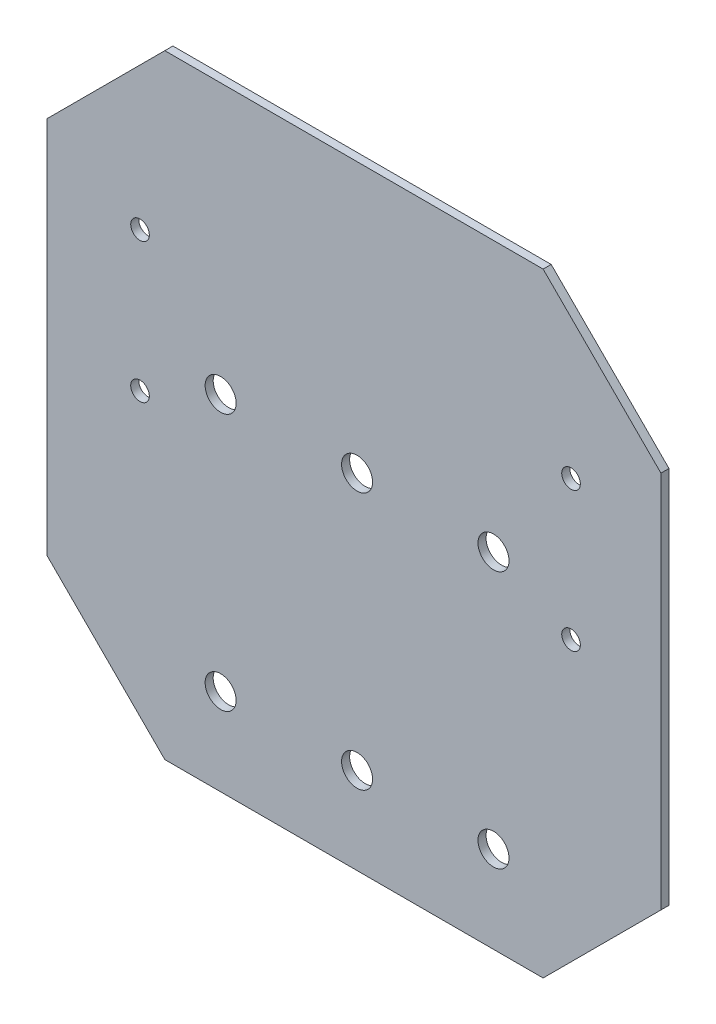
ISO-10303-21;
HEADER;
FILE_DESCRIPTION(('STEP AP214'),'2;1');
FILE_NAME('part.step','',(''),(''),'','','');
FILE_SCHEMA(('AUTOMOTIVE_DESIGN { 1 0 10303 214 1 1 1 1 }'));
ENDSEC;
DATA;
#1=APPLICATION_CONTEXT('core data for automotive mechanical design processes');
#2=APPLICATION_PROTOCOL_DEFINITION('international standard','automotive_design',2000,#1);
#3=PRODUCT_CONTEXT('',#1,'mechanical');
#4=PRODUCT('Part','Part','',(#3));
#5=PRODUCT_RELATED_PRODUCT_CATEGORY('part','',(#4));
#6=PRODUCT_DEFINITION_FORMATION('','',#4);
#7=PRODUCT_DEFINITION_CONTEXT('part definition',#1,'design');
#8=PRODUCT_DEFINITION('design','',#6,#7);
#9=PRODUCT_DEFINITION_SHAPE('','',#8);
#10=(LENGTH_UNIT() NAMED_UNIT(*) SI_UNIT(.MILLI.,.METRE.));
#11=(NAMED_UNIT(*) PLANE_ANGLE_UNIT() SI_UNIT($,.RADIAN.));
#12=(NAMED_UNIT(*) SI_UNIT($,.STERADIAN.) SOLID_ANGLE_UNIT());
#13=UNCERTAINTY_MEASURE_WITH_UNIT(LENGTH_MEASURE(1.E-05),#10,'distance_accuracy_value','');
#14=(GEOMETRIC_REPRESENTATION_CONTEXT(3) GLOBAL_UNCERTAINTY_ASSIGNED_CONTEXT((#13)) GLOBAL_UNIT_ASSIGNED_CONTEXT((#10,
#11,#12)) REPRESENTATION_CONTEXT('',''));
#15=CARTESIAN_POINT('',(0.,0.,0.));
#16=DIRECTION('',(0.,0.,1.));
#17=DIRECTION('',(1.,0.,0.));
#18=AXIS2_PLACEMENT_3D('',#15,#16,#17);
#19=CARTESIAN_POINT('',(0.,0.,1.3));
#20=DIRECTION('',(0.,0.,-1.));
#21=DIRECTION('',(-1.,0.,0.));
#22=AXIS2_PLACEMENT_3D('',#19,#20,#21);
#23=PLANE('',#22);
#24=CARTESIAN_POINT('',(50.3246763242411,35.186140305157,1.3));
#25=DIRECTION('',(0.,0.,1.));
#26=DIRECTION('',(1.,0.,0.));
#27=AXIS2_PLACEMENT_3D('',#24,#25,#26);
#28=CIRCLE('',#27,1.5);
#29=CARTESIAN_POINT('',(51.8246763242411,35.186140305157,1.3));
#30=VERTEX_POINT('',#29);
#31=EDGE_CURVE('E223',#30,#30,#28,.T.);
#32=ORIENTED_EDGE('',*,*,#31,.F.);
#33=EDGE_LOOP('',(#32));
#34=FACE_BOUND('',#33,.T.);
#35=CARTESIAN_POINT('',(-19.1753236757587,12.686140305157,1.3));
#36=DIRECTION('',(0.,0.,1.));
#37=DIRECTION('',(1.,0.,0.));
#38=AXIS2_PLACEMENT_3D('',#35,#36,#37);
#39=CIRCLE('',#38,1.5);
#40=CARTESIAN_POINT('',(-17.6753236757587,12.686140305157,1.3));
#41=VERTEX_POINT('',#40);
#42=EDGE_CURVE('E211',#41,#41,#39,.T.);
#43=ORIENTED_EDGE('',*,*,#42,.F.);
#44=EDGE_LOOP('',(#43));
#45=FACE_BOUND('',#44,.T.);
#46=CARTESIAN_POINT('',(37.8246763242411,-22.8138596948429,1.3));
#47=DIRECTION('',(0.,0.,1.));
#48=DIRECTION('',(1.,0.,0.));
#49=AXIS2_PLACEMENT_3D('',#46,#47,#48);
#50=CIRCLE('',#49,2.5);
#51=CARTESIAN_POINT('',(40.3246763242411,-22.8138596948429,1.3));
#52=VERTEX_POINT('',#51);
#53=EDGE_CURVE('E199',#52,#52,#50,.T.);
#54=ORIENTED_EDGE('',*,*,#53,.F.);
#55=EDGE_LOOP('',(#54));
#56=FACE_BOUND('',#55,.T.);
#57=CARTESIAN_POINT('',(37.8246763242411,18.6861403051571,1.3));
#58=DIRECTION('',(0.,0.,1.));
#59=DIRECTION('',(1.,0.,0.));
#60=AXIS2_PLACEMENT_3D('',#57,#58,#59);
#61=CIRCLE('',#60,2.5);
#62=CARTESIAN_POINT('',(40.3246763242411,18.6861403051571,1.3));
#63=VERTEX_POINT('',#62);
#64=EDGE_CURVE('E187',#63,#63,#61,.T.);
#65=ORIENTED_EDGE('',*,*,#64,.F.);
#66=EDGE_LOOP('',(#65));
#67=FACE_BOUND('',#66,.T.);
#68=CARTESIAN_POINT('',(-6.17532367575889,18.6861403051571,1.3));
#69=DIRECTION('',(0.,0.,1.));
#70=DIRECTION('',(1.,0.,0.));
#71=AXIS2_PLACEMENT_3D('',#68,#69,#70);
#72=CIRCLE('',#71,2.5);
#73=CARTESIAN_POINT('',(-3.67532367575889,18.6861403051571,1.3));
#74=VERTEX_POINT('',#73);
#75=EDGE_CURVE('E133',#74,#74,#72,.T.);
#76=ORIENTED_EDGE('',*,*,#75,.F.);
#77=EDGE_LOOP('',(#76));
#78=FACE_BOUND('',#77,.T.);
#79=DIRECTION('',(-0.707106781186547,-0.707106781186548,0.));
#80=VECTOR('',#79,1.);
#81=CARTESIAN_POINT('',(-15.1753236757587,62.186140305157,1.3));
#82=LINE('',#81,#80);
#83=CARTESIAN_POINT('',(-15.1753236757587,62.186140305157,1.3));
#84=VERTEX_POINT('',#83);
#85=CARTESIAN_POINT('',(-34.1753236757587,43.186140305157,1.3));
#86=VERTEX_POINT('',#85);
#87=EDGE_CURVE('E144',#84,#86,#82,.T.);
#88=ORIENTED_EDGE('',*,*,#87,.T.);
#89=DIRECTION('',(0.,-1.,0.));
#90=VECTOR('',#89,1.);
#91=CARTESIAN_POINT('',(-34.1753236757587,43.186140305157,1.3));
#92=LINE('',#91,#90);
#93=CARTESIAN_POINT('',(-34.1753236757587,-17.813859694843,1.3));
#94=VERTEX_POINT('',#93);
#95=EDGE_CURVE('E92',#86,#94,#92,.T.);
#96=ORIENTED_EDGE('',*,*,#95,.T.);
#97=DIRECTION('',(0.707106781186549,-0.707106781186546,0.));
#98=VECTOR('',#97,1.);
#99=CARTESIAN_POINT('',(-15.1753236757588,-36.8138596948428,1.3));
#100=LINE('',#99,#98);
#101=CARTESIAN_POINT('',(-15.1753236757588,-36.8138596948428,1.3));
#102=VERTEX_POINT('',#101);
#103=EDGE_CURVE('E159',#94,#102,#100,.T.);
#104=ORIENTED_EDGE('',*,*,#103,.T.);
#105=DIRECTION('',(1.,0.,0.));
#106=VECTOR('',#105,1.);
#107=CARTESIAN_POINT('',(45.8246763242411,-36.8138596948428,1.3));
#108=LINE('',#107,#106);
#109=CARTESIAN_POINT('',(45.8246763242411,-36.8138596948428,1.3));
#110=VERTEX_POINT('',#109);
#111=EDGE_CURVE('E172',#102,#110,#108,.T.);
#112=ORIENTED_EDGE('',*,*,#111,.T.);
#113=DIRECTION('',(0.707106781186546,0.707106781186549,0.));
#114=VECTOR('',#113,1.);
#115=CARTESIAN_POINT('',(64.8246763242411,-17.8138596948428,1.3));
#116=LINE('',#115,#114);
#117=CARTESIAN_POINT('',(64.8246763242411,-17.8138596948428,1.3));
#118=VERTEX_POINT('',#117);
#119=EDGE_CURVE('E111',#110,#118,#116,.T.);
#120=ORIENTED_EDGE('',*,*,#119,.T.);
#121=DIRECTION('',(0.,1.,0.));
#122=VECTOR('',#121,1.);
#123=CARTESIAN_POINT('',(64.8246763242413,43.1861403051571,1.3));
#124=LINE('',#123,#122);
#125=CARTESIAN_POINT('',(64.8246763242413,43.1861403051571,1.3));
#126=VERTEX_POINT('',#125);
#127=EDGE_CURVE('E105',#118,#126,#124,.T.);
#128=ORIENTED_EDGE('',*,*,#127,.T.);
#129=DIRECTION('',(-0.707106781186548,0.707106781186547,0.));
#130=VECTOR('',#129,1.);
#131=CARTESIAN_POINT('',(45.8246763242413,62.186140305157,1.3));
#132=LINE('',#131,#130);
#133=CARTESIAN_POINT('',(45.8246763242413,62.186140305157,1.3));
#134=VERTEX_POINT('',#133);
#135=EDGE_CURVE('E109',#126,#134,#132,.T.);
#136=ORIENTED_EDGE('',*,*,#135,.T.);
#137=DIRECTION('',(-1.,0.,0.));
#138=VECTOR('',#137,1.);
#139=CARTESIAN_POINT('',(-15.1753236757587,62.186140305157,1.3));
#140=LINE('',#139,#138);
#141=EDGE_CURVE('E49',#134,#84,#140,.T.);
#142=ORIENTED_EDGE('',*,*,#141,.T.);
#143=EDGE_LOOP('',(#88,#96,#104,#112,#120,#128,#136,#142));
#144=FACE_BOUND('',#143,.T.);
#145=CARTESIAN_POINT('',(15.8246763242411,18.6861403051571,1.3));
#146=DIRECTION('',(0.,0.,1.));
#147=DIRECTION('',(1.,0.,0.));
#148=AXIS2_PLACEMENT_3D('',#145,#146,#147);
#149=CIRCLE('',#148,2.5);
#150=CARTESIAN_POINT('',(18.3246763242411,18.6861403051571,1.3));
#151=VERTEX_POINT('',#150);
#152=EDGE_CURVE('E181',#151,#151,#149,.T.);
#153=ORIENTED_EDGE('',*,*,#152,.F.);
#154=EDGE_LOOP('',(#153));
#155=FACE_BOUND('',#154,.T.);
#156=CARTESIAN_POINT('',(15.8246763242411,-22.8138596948429,1.3));
#157=DIRECTION('',(0.,0.,1.));
#158=DIRECTION('',(1.,0.,0.));
#159=AXIS2_PLACEMENT_3D('',#156,#157,#158);
#160=CIRCLE('',#159,2.5);
#161=CARTESIAN_POINT('',(18.3246763242411,-22.8138596948429,1.3));
#162=VERTEX_POINT('',#161);
#163=EDGE_CURVE('E193',#162,#162,#160,.T.);
#164=ORIENTED_EDGE('',*,*,#163,.F.);
#165=EDGE_LOOP('',(#164));
#166=FACE_BOUND('',#165,.T.);
#167=CARTESIAN_POINT('',(-6.17532367575889,-22.8138596948429,1.3));
#168=DIRECTION('',(0.,0.,1.));
#169=DIRECTION('',(1.,0.,0.));
#170=AXIS2_PLACEMENT_3D('',#167,#168,#169);
#171=CIRCLE('',#170,2.5);
#172=CARTESIAN_POINT('',(-3.67532367575889,-22.8138596948429,1.3));
#173=VERTEX_POINT('',#172);
#174=EDGE_CURVE('E205',#173,#173,#171,.T.);
#175=ORIENTED_EDGE('',*,*,#174,.F.);
#176=EDGE_LOOP('',(#175));
#177=FACE_BOUND('',#176,.T.);
#178=CARTESIAN_POINT('',(-19.1753236757587,35.186140305157,1.3));
#179=DIRECTION('',(0.,0.,1.));
#180=DIRECTION('',(1.,0.,0.));
#181=AXIS2_PLACEMENT_3D('',#178,#179,#180);
#182=CIRCLE('',#181,1.5);
#183=CARTESIAN_POINT('',(-17.6753236757587,35.186140305157,1.3));
#184=VERTEX_POINT('',#183);
#185=EDGE_CURVE('E217',#184,#184,#182,.T.);
#186=ORIENTED_EDGE('',*,*,#185,.F.);
#187=EDGE_LOOP('',(#186));
#188=FACE_BOUND('',#187,.T.);
#189=CARTESIAN_POINT('',(50.3246763242411,12.686140305157,1.3));
#190=DIRECTION('',(0.,0.,1.));
#191=DIRECTION('',(1.,0.,0.));
#192=AXIS2_PLACEMENT_3D('',#189,#190,#191);
#193=CIRCLE('',#192,1.5);
#194=CARTESIAN_POINT('',(51.8246763242411,12.686140305157,1.3));
#195=VERTEX_POINT('',#194);
#196=EDGE_CURVE('E229',#195,#195,#193,.T.);
#197=ORIENTED_EDGE('',*,*,#196,.F.);
#198=EDGE_LOOP('',(#197));
#199=FACE_BOUND('',#198,.T.);
#200=ADVANCED_FACE('F32',(#34,#45,#56,#67,#78,#144,#155,#166,#177,#188,#199),#23,.F.);
#201=CARTESIAN_POINT('',(0.,0.,0.));
#202=DIRECTION('',(0.,0.,-1.));
#203=DIRECTION('',(-1.,0.,0.));
#204=AXIS2_PLACEMENT_3D('',#201,#202,#203);
#205=PLANE('',#204);
#206=CARTESIAN_POINT('',(50.3246763242411,35.186140305157,0.));
#207=DIRECTION('',(0.,0.,1.));
#208=DIRECTION('',(1.,0.,0.));
#209=AXIS2_PLACEMENT_3D('',#206,#207,#208);
#210=CIRCLE('',#209,1.5);
#211=CARTESIAN_POINT('',(51.8246763242411,35.186140305157,0.));
#212=VERTEX_POINT('',#211);
#213=EDGE_CURVE('E226',#212,#212,#210,.T.);
#214=ORIENTED_EDGE('',*,*,#213,.T.);
#215=EDGE_LOOP('',(#214));
#216=FACE_BOUND('',#215,.T.);
#217=CARTESIAN_POINT('',(-19.1753236757587,12.686140305157,0.));
#218=DIRECTION('',(0.,0.,1.));
#219=DIRECTION('',(1.,0.,0.));
#220=AXIS2_PLACEMENT_3D('',#217,#218,#219);
#221=CIRCLE('',#220,1.5);
#222=CARTESIAN_POINT('',(-17.6753236757587,12.686140305157,0.));
#223=VERTEX_POINT('',#222);
#224=EDGE_CURVE('E214',#223,#223,#221,.T.);
#225=ORIENTED_EDGE('',*,*,#224,.T.);
#226=EDGE_LOOP('',(#225));
#227=FACE_BOUND('',#226,.T.);
#228=CARTESIAN_POINT('',(37.8246763242411,-22.8138596948429,0.));
#229=DIRECTION('',(0.,0.,1.));
#230=DIRECTION('',(1.,0.,0.));
#231=AXIS2_PLACEMENT_3D('',#228,#229,#230);
#232=CIRCLE('',#231,2.5);
#233=CARTESIAN_POINT('',(40.3246763242411,-22.8138596948429,0.));
#234=VERTEX_POINT('',#233);
#235=EDGE_CURVE('E202',#234,#234,#232,.T.);
#236=ORIENTED_EDGE('',*,*,#235,.T.);
#237=EDGE_LOOP('',(#236));
#238=FACE_BOUND('',#237,.T.);
#239=CARTESIAN_POINT('',(37.8246763242411,18.6861403051571,0.));
#240=DIRECTION('',(0.,0.,1.));
#241=DIRECTION('',(1.,0.,0.));
#242=AXIS2_PLACEMENT_3D('',#239,#240,#241);
#243=CIRCLE('',#242,2.5);
#244=CARTESIAN_POINT('',(40.3246763242411,18.6861403051571,0.));
#245=VERTEX_POINT('',#244);
#246=EDGE_CURVE('E190',#245,#245,#243,.T.);
#247=ORIENTED_EDGE('',*,*,#246,.T.);
#248=EDGE_LOOP('',(#247));
#249=FACE_BOUND('',#248,.T.);
#250=CARTESIAN_POINT('',(-6.17532367575889,18.6861403051571,0.));
#251=DIRECTION('',(0.,0.,1.));
#252=DIRECTION('',(1.,0.,0.));
#253=AXIS2_PLACEMENT_3D('',#250,#251,#252);
#254=CIRCLE('',#253,2.5);
#255=CARTESIAN_POINT('',(-3.67532367575889,18.6861403051571,0.));
#256=VERTEX_POINT('',#255);
#257=EDGE_CURVE('E178',#256,#256,#254,.T.);
#258=ORIENTED_EDGE('',*,*,#257,.T.);
#259=EDGE_LOOP('',(#258));
#260=FACE_BOUND('',#259,.T.);
#261=DIRECTION('',(-0.707106781186547,-0.707106781186548,0.));
#262=VECTOR('',#261,1.);
#263=CARTESIAN_POINT('',(-15.1753236757587,62.186140305157,0.));
#264=LINE('',#263,#262);
#265=CARTESIAN_POINT('',(-15.1753236757587,62.186140305157,0.));
#266=VERTEX_POINT('',#265);
#267=CARTESIAN_POINT('',(-34.1753236757587,43.186140305157,0.));
#268=VERTEX_POINT('',#267);
#269=EDGE_CURVE('E129',#266,#268,#264,.T.);
#270=ORIENTED_EDGE('',*,*,#269,.F.);
#271=DIRECTION('',(-1.,0.,0.));
#272=VECTOR('',#271,1.);
#273=CARTESIAN_POINT('',(-15.1753236757587,62.186140305157,0.));
#274=LINE('',#273,#272);
#275=CARTESIAN_POINT('',(45.8246763242413,62.186140305157,0.));
#276=VERTEX_POINT('',#275);
#277=EDGE_CURVE('E84',#276,#266,#274,.T.);
#278=ORIENTED_EDGE('',*,*,#277,.F.);
#279=DIRECTION('',(-0.707106781186548,0.707106781186547,0.));
#280=VECTOR('',#279,1.);
#281=CARTESIAN_POINT('',(45.8246763242413,62.186140305157,0.));
#282=LINE('',#281,#280);
#283=CARTESIAN_POINT('',(64.8246763242413,43.1861403051571,0.));
#284=VERTEX_POINT('',#283);
#285=EDGE_CURVE('E78',#284,#276,#282,.T.);
#286=ORIENTED_EDGE('',*,*,#285,.F.);
#287=DIRECTION('',(0.,1.,0.));
#288=VECTOR('',#287,1.);
#289=CARTESIAN_POINT('',(64.8246763242413,43.1861403051571,0.));
#290=LINE('',#289,#288);
#291=CARTESIAN_POINT('',(64.8246763242411,-17.8138596948428,0.));
#292=VERTEX_POINT('',#291);
#293=EDGE_CURVE('E119',#292,#284,#290,.T.);
#294=ORIENTED_EDGE('',*,*,#293,.F.);
#295=DIRECTION('',(0.707106781186546,0.707106781186549,0.));
#296=VECTOR('',#295,1.);
#297=CARTESIAN_POINT('',(64.8246763242411,-17.8138596948428,0.));
#298=LINE('',#297,#296);
#299=CARTESIAN_POINT('',(45.8246763242411,-36.8138596948428,0.));
#300=VERTEX_POINT('',#299);
#301=EDGE_CURVE('E139',#300,#292,#298,.T.);
#302=ORIENTED_EDGE('',*,*,#301,.F.);
#303=DIRECTION('',(1.,0.,0.));
#304=VECTOR('',#303,1.);
#305=CARTESIAN_POINT('',(45.8246763242411,-36.8138596948428,0.));
#306=LINE('',#305,#304);
#307=CARTESIAN_POINT('',(-15.1753236757588,-36.8138596948428,0.));
#308=VERTEX_POINT('',#307);
#309=EDGE_CURVE('E137',#308,#300,#306,.T.);
#310=ORIENTED_EDGE('',*,*,#309,.F.);
#311=DIRECTION('',(0.707106781186549,-0.707106781186546,0.));
#312=VECTOR('',#311,1.);
#313=CARTESIAN_POINT('',(-15.1753236757588,-36.8138596948428,0.));
#314=LINE('',#313,#312);
#315=CARTESIAN_POINT('',(-34.1753236757587,-17.813859694843,0.));
#316=VERTEX_POINT('',#315);
#317=EDGE_CURVE('E135',#316,#308,#314,.T.);
#318=ORIENTED_EDGE('',*,*,#317,.F.);
#319=DIRECTION('',(0.,-1.,0.));
#320=VECTOR('',#319,1.);
#321=CARTESIAN_POINT('',(-34.1753236757587,43.186140305157,0.));
#322=LINE('',#321,#320);
#323=EDGE_CURVE('E132',#268,#316,#322,.T.);
#324=ORIENTED_EDGE('',*,*,#323,.F.);
#325=EDGE_LOOP('',(#270,#278,#286,#294,#302,#310,#318,#324));
#326=FACE_BOUND('',#325,.T.);
#327=CARTESIAN_POINT('',(15.8246763242411,18.6861403051571,0.));
#328=DIRECTION('',(0.,0.,1.));
#329=DIRECTION('',(1.,0.,0.));
#330=AXIS2_PLACEMENT_3D('',#327,#328,#329);
#331=CIRCLE('',#330,2.5);
#332=CARTESIAN_POINT('',(18.3246763242411,18.6861403051571,0.));
#333=VERTEX_POINT('',#332);
#334=EDGE_CURVE('E184',#333,#333,#331,.T.);
#335=ORIENTED_EDGE('',*,*,#334,.T.);
#336=EDGE_LOOP('',(#335));
#337=FACE_BOUND('',#336,.T.);
#338=CARTESIAN_POINT('',(15.8246763242411,-22.8138596948429,0.));
#339=DIRECTION('',(0.,0.,1.));
#340=DIRECTION('',(1.,0.,0.));
#341=AXIS2_PLACEMENT_3D('',#338,#339,#340);
#342=CIRCLE('',#341,2.5);
#343=CARTESIAN_POINT('',(18.3246763242411,-22.8138596948429,0.));
#344=VERTEX_POINT('',#343);
#345=EDGE_CURVE('E196',#344,#344,#342,.T.);
#346=ORIENTED_EDGE('',*,*,#345,.T.);
#347=EDGE_LOOP('',(#346));
#348=FACE_BOUND('',#347,.T.);
#349=CARTESIAN_POINT('',(-6.17532367575889,-22.8138596948429,0.));
#350=DIRECTION('',(0.,0.,1.));
#351=DIRECTION('',(1.,0.,0.));
#352=AXIS2_PLACEMENT_3D('',#349,#350,#351);
#353=CIRCLE('',#352,2.5);
#354=CARTESIAN_POINT('',(-3.67532367575889,-22.8138596948429,0.));
#355=VERTEX_POINT('',#354);
#356=EDGE_CURVE('E208',#355,#355,#353,.T.);
#357=ORIENTED_EDGE('',*,*,#356,.T.);
#358=EDGE_LOOP('',(#357));
#359=FACE_BOUND('',#358,.T.);
#360=CARTESIAN_POINT('',(-19.1753236757587,35.186140305157,0.));
#361=DIRECTION('',(0.,0.,1.));
#362=DIRECTION('',(1.,0.,0.));
#363=AXIS2_PLACEMENT_3D('',#360,#361,#362);
#364=CIRCLE('',#363,1.5);
#365=CARTESIAN_POINT('',(-17.6753236757587,35.186140305157,0.));
#366=VERTEX_POINT('',#365);
#367=EDGE_CURVE('E220',#366,#366,#364,.T.);
#368=ORIENTED_EDGE('',*,*,#367,.T.);
#369=EDGE_LOOP('',(#368));
#370=FACE_BOUND('',#369,.T.);
#371=CARTESIAN_POINT('',(50.3246763242411,12.686140305157,0.));
#372=DIRECTION('',(0.,0.,1.));
#373=DIRECTION('',(1.,0.,0.));
#374=AXIS2_PLACEMENT_3D('',#371,#372,#373);
#375=CIRCLE('',#374,1.5);
#376=CARTESIAN_POINT('',(51.8246763242411,12.686140305157,0.));
#377=VERTEX_POINT('',#376);
#378=EDGE_CURVE('E232',#377,#377,#375,.T.);
#379=ORIENTED_EDGE('',*,*,#378,.T.);
#380=EDGE_LOOP('',(#379));
#381=FACE_BOUND('',#380,.T.);
#382=ADVANCED_FACE('F163',(#216,#227,#238,#249,#260,#326,#337,#348,#359,#370,#381),#205,.T.);
#383=CARTESIAN_POINT('',(-15.1753236757587,62.186140305157,1.3));
#384=DIRECTION('',(0.707106781186548,-0.707106781186547,0.));
#385=DIRECTION('',(0.707106781186547,0.707106781186548,0.));
#386=AXIS2_PLACEMENT_3D('',#383,#384,#385);
#387=PLANE('',#386);
#388=ORIENTED_EDGE('',*,*,#269,.T.);
#389=DIRECTION('',(0.,0.,-1.));
#390=VECTOR('',#389,1.);
#391=CARTESIAN_POINT('',(-34.1753236757587,43.186140305157,1.3));
#392=LINE('',#391,#390);
#393=EDGE_CURVE('E11',#86,#268,#392,.T.);
#394=ORIENTED_EDGE('',*,*,#393,.F.);
#395=ORIENTED_EDGE('',*,*,#87,.F.);
#396=DIRECTION('',(0.,0.,-1.));
#397=VECTOR('',#396,1.);
#398=CARTESIAN_POINT('',(-15.1753236757587,62.186140305157,1.3));
#399=LINE('',#398,#397);
#400=EDGE_CURVE('E125',#84,#266,#399,.T.);
#401=ORIENTED_EDGE('',*,*,#400,.T.);
#402=EDGE_LOOP('',(#388,#394,#395,#401));
#403=FACE_BOUND('',#402,.T.);
#404=ADVANCED_FACE('F34',(#403),#387,.F.);
#405=CARTESIAN_POINT('',(-34.1753236757587,43.186140305157,1.3));
#406=DIRECTION('',(1.,0.,0.));
#407=DIRECTION('',(0.,1.,0.));
#408=AXIS2_PLACEMENT_3D('',#405,#406,#407);
#409=PLANE('',#408);
#410=ORIENTED_EDGE('',*,*,#323,.T.);
#411=DIRECTION('',(0.,0.,-1.));
#412=VECTOR('',#411,1.);
#413=CARTESIAN_POINT('',(-34.1753236757587,-17.813859694843,1.3));
#414=LINE('',#413,#412);
#415=EDGE_CURVE('E41',#94,#316,#414,.T.);
#416=ORIENTED_EDGE('',*,*,#415,.F.);
#417=ORIENTED_EDGE('',*,*,#95,.F.);
#418=ORIENTED_EDGE('',*,*,#393,.T.);
#419=EDGE_LOOP('',(#410,#416,#417,#418));
#420=FACE_BOUND('',#419,.T.);
#421=ADVANCED_FACE('F267',(#420),#409,.F.);
#422=CARTESIAN_POINT('',(-15.1753236757588,-36.8138596948428,1.3));
#423=DIRECTION('',(0.707106781186546,0.707106781186549,0.));
#424=DIRECTION('',(-0.707106781186549,0.707106781186546,0.));
#425=AXIS2_PLACEMENT_3D('',#422,#423,#424);
#426=PLANE('',#425);
#427=ORIENTED_EDGE('',*,*,#317,.T.);
#428=DIRECTION('',(0.,0.,-1.));
#429=VECTOR('',#428,1.);
#430=CARTESIAN_POINT('',(-15.1753236757588,-36.8138596948428,1.3));
#431=LINE('',#430,#429);
#432=EDGE_CURVE('E151',#102,#308,#431,.T.);
#433=ORIENTED_EDGE('',*,*,#432,.F.);
#434=ORIENTED_EDGE('',*,*,#103,.F.);
#435=ORIENTED_EDGE('',*,*,#415,.T.);
#436=EDGE_LOOP('',(#427,#433,#434,#435));
#437=FACE_BOUND('',#436,.T.);
#438=ADVANCED_FACE('F157',(#437),#426,.F.);
#439=CARTESIAN_POINT('',(45.8246763242411,-36.8138596948428,1.3));
#440=DIRECTION('',(0.,1.,0.));
#441=DIRECTION('',(-1.,0.,0.));
#442=AXIS2_PLACEMENT_3D('',#439,#440,#441);
#443=PLANE('',#442);
#444=ORIENTED_EDGE('',*,*,#309,.T.);
#445=DIRECTION('',(0.,0.,-1.));
#446=VECTOR('',#445,1.);
#447=CARTESIAN_POINT('',(45.8246763242411,-36.8138596948428,1.3));
#448=LINE('',#447,#446);
#449=EDGE_CURVE('E148',#110,#300,#448,.T.);
#450=ORIENTED_EDGE('',*,*,#449,.F.);
#451=ORIENTED_EDGE('',*,*,#111,.F.);
#452=ORIENTED_EDGE('',*,*,#432,.T.);
#453=EDGE_LOOP('',(#444,#450,#451,#452));
#454=FACE_BOUND('',#453,.T.);
#455=ADVANCED_FACE('F168',(#454),#443,.F.);
#456=CARTESIAN_POINT('',(64.8246763242411,-17.8138596948428,1.3));
#457=DIRECTION('',(-0.707106781186549,0.707106781186546,0.));
#458=DIRECTION('',(-0.707106781186546,-0.707106781186549,0.));
#459=AXIS2_PLACEMENT_3D('',#456,#457,#458);
#460=PLANE('',#459);
#461=ORIENTED_EDGE('',*,*,#301,.T.);
#462=DIRECTION('',(0.,0.,-1.));
#463=VECTOR('',#462,1.);
#464=CARTESIAN_POINT('',(64.8246763242411,-17.8138596948428,1.3));
#465=LINE('',#464,#463);
#466=EDGE_CURVE('E120',#118,#292,#465,.T.);
#467=ORIENTED_EDGE('',*,*,#466,.F.);
#468=ORIENTED_EDGE('',*,*,#119,.F.);
#469=ORIENTED_EDGE('',*,*,#449,.T.);
#470=EDGE_LOOP('',(#461,#467,#468,#469));
#471=FACE_BOUND('',#470,.T.);
#472=ADVANCED_FACE('F171',(#471),#460,.F.);
#473=CARTESIAN_POINT('',(64.8246763242413,43.1861403051571,1.3));
#474=DIRECTION('',(-1.,0.,0.));
#475=DIRECTION('',(0.,-1.,0.));
#476=AXIS2_PLACEMENT_3D('',#473,#474,#475);
#477=PLANE('',#476);
#478=ORIENTED_EDGE('',*,*,#293,.T.);
#479=DIRECTION('',(0.,0.,-1.));
#480=VECTOR('',#479,1.);
#481=CARTESIAN_POINT('',(64.8246763242413,43.1861403051571,1.3));
#482=LINE('',#481,#480);
#483=EDGE_CURVE('E116',#126,#284,#482,.T.);
#484=ORIENTED_EDGE('',*,*,#483,.F.);
#485=ORIENTED_EDGE('',*,*,#127,.F.);
#486=ORIENTED_EDGE('',*,*,#466,.T.);
#487=EDGE_LOOP('',(#478,#484,#485,#486));
#488=FACE_BOUND('',#487,.T.);
#489=ADVANCED_FACE('F117',(#488),#477,.F.);
#490=CARTESIAN_POINT('',(45.8246763242413,62.186140305157,1.3));
#491=DIRECTION('',(-0.707106781186547,-0.707106781186548,0.));
#492=DIRECTION('',(0.707106781186548,-0.707106781186547,0.));
#493=AXIS2_PLACEMENT_3D('',#490,#491,#492);
#494=PLANE('',#493);
#495=ORIENTED_EDGE('',*,*,#285,.T.);
#496=DIRECTION('',(0.,0.,-1.));
#497=VECTOR('',#496,1.);
#498=CARTESIAN_POINT('',(45.8246763242413,62.186140305157,1.3));
#499=LINE('',#498,#497);
#500=EDGE_CURVE('E121',#134,#276,#499,.T.);
#501=ORIENTED_EDGE('',*,*,#500,.F.);
#502=ORIENTED_EDGE('',*,*,#135,.F.);
#503=ORIENTED_EDGE('',*,*,#483,.T.);
#504=EDGE_LOOP('',(#495,#501,#502,#503));
#505=FACE_BOUND('',#504,.T.);
#506=ADVANCED_FACE('F123',(#505),#494,.F.);
#507=CARTESIAN_POINT('',(-15.1753236757587,62.186140305157,1.3));
#508=DIRECTION('',(0.,-1.,0.));
#509=DIRECTION('',(1.,0.,0.));
#510=AXIS2_PLACEMENT_3D('',#507,#508,#509);
#511=PLANE('',#510);
#512=ORIENTED_EDGE('',*,*,#277,.T.);
#513=ORIENTED_EDGE('',*,*,#400,.F.);
#514=ORIENTED_EDGE('',*,*,#141,.F.);
#515=ORIENTED_EDGE('',*,*,#500,.T.);
#516=EDGE_LOOP('',(#512,#513,#514,#515));
#517=FACE_BOUND('',#516,.T.);
#518=ADVANCED_FACE('F255',(#517),#511,.F.);
#519=CARTESIAN_POINT('',(-6.17532367575889,18.6861403051571,1.3));
#520=DIRECTION('',(0.,0.,-1.));
#521=DIRECTION('',(-1.,0.,0.));
#522=AXIS2_PLACEMENT_3D('',#519,#520,#521);
#523=CYLINDRICAL_SURFACE('',#522,2.5);
#524=ORIENTED_EDGE('',*,*,#75,.T.);
#525=EDGE_LOOP('',(#524));
#526=FACE_BOUND('',#525,.T.);
#527=ORIENTED_EDGE('',*,*,#257,.F.);
#528=EDGE_LOOP('',(#527));
#529=FACE_BOUND('',#528,.T.);
#530=ADVANCED_FACE('F252',(#526,#529),#523,.F.);
#531=CARTESIAN_POINT('',(15.8246763242411,18.6861403051571,1.3));
#532=DIRECTION('',(0.,0.,-1.));
#533=DIRECTION('',(-1.,0.,0.));
#534=AXIS2_PLACEMENT_3D('',#531,#532,#533);
#535=CYLINDRICAL_SURFACE('',#534,2.5);
#536=ORIENTED_EDGE('',*,*,#152,.T.);
#537=EDGE_LOOP('',(#536));
#538=FACE_BOUND('',#537,.T.);
#539=ORIENTED_EDGE('',*,*,#334,.F.);
#540=EDGE_LOOP('',(#539));
#541=FACE_BOUND('',#540,.T.);
#542=ADVANCED_FACE('F331',(#538,#541),#535,.F.);
#543=CARTESIAN_POINT('',(37.8246763242411,18.6861403051571,1.3));
#544=DIRECTION('',(0.,0.,-1.));
#545=DIRECTION('',(-1.,0.,0.));
#546=AXIS2_PLACEMENT_3D('',#543,#544,#545);
#547=CYLINDRICAL_SURFACE('',#546,2.5);
#548=ORIENTED_EDGE('',*,*,#64,.T.);
#549=EDGE_LOOP('',(#548));
#550=FACE_BOUND('',#549,.T.);
#551=ORIENTED_EDGE('',*,*,#246,.F.);
#552=EDGE_LOOP('',(#551));
#553=FACE_BOUND('',#552,.T.);
#554=ADVANCED_FACE('F339',(#550,#553),#547,.F.);
#555=CARTESIAN_POINT('',(15.8246763242411,-22.8138596948429,1.3));
#556=DIRECTION('',(0.,0.,-1.));
#557=DIRECTION('',(-1.,0.,0.));
#558=AXIS2_PLACEMENT_3D('',#555,#556,#557);
#559=CYLINDRICAL_SURFACE('',#558,2.5);
#560=ORIENTED_EDGE('',*,*,#163,.T.);
#561=EDGE_LOOP('',(#560));
#562=FACE_BOUND('',#561,.T.);
#563=ORIENTED_EDGE('',*,*,#345,.F.);
#564=EDGE_LOOP('',(#563));
#565=FACE_BOUND('',#564,.T.);
#566=ADVANCED_FACE('F347',(#562,#565),#559,.F.);
#567=CARTESIAN_POINT('',(37.8246763242411,-22.8138596948429,1.3));
#568=DIRECTION('',(0.,0.,-1.));
#569=DIRECTION('',(-1.,0.,0.));
#570=AXIS2_PLACEMENT_3D('',#567,#568,#569);
#571=CYLINDRICAL_SURFACE('',#570,2.5);
#572=ORIENTED_EDGE('',*,*,#53,.T.);
#573=EDGE_LOOP('',(#572));
#574=FACE_BOUND('',#573,.T.);
#575=ORIENTED_EDGE('',*,*,#235,.F.);
#576=EDGE_LOOP('',(#575));
#577=FACE_BOUND('',#576,.T.);
#578=ADVANCED_FACE('F356',(#574,#577),#571,.F.);
#579=CARTESIAN_POINT('',(-6.17532367575889,-22.8138596948429,1.3));
#580=DIRECTION('',(0.,0.,-1.));
#581=DIRECTION('',(-1.,0.,0.));
#582=AXIS2_PLACEMENT_3D('',#579,#580,#581);
#583=CYLINDRICAL_SURFACE('',#582,2.5);
#584=ORIENTED_EDGE('',*,*,#174,.T.);
#585=EDGE_LOOP('',(#584));
#586=FACE_BOUND('',#585,.T.);
#587=ORIENTED_EDGE('',*,*,#356,.F.);
#588=EDGE_LOOP('',(#587));
#589=FACE_BOUND('',#588,.T.);
#590=ADVANCED_FACE('F365',(#586,#589),#583,.F.);
#591=CARTESIAN_POINT('',(-19.1753236757587,12.686140305157,1.3));
#592=DIRECTION('',(0.,0.,-1.));
#593=DIRECTION('',(-1.,0.,0.));
#594=AXIS2_PLACEMENT_3D('',#591,#592,#593);
#595=CYLINDRICAL_SURFACE('',#594,1.5);
#596=ORIENTED_EDGE('',*,*,#42,.T.);
#597=EDGE_LOOP('',(#596));
#598=FACE_BOUND('',#597,.T.);
#599=ORIENTED_EDGE('',*,*,#224,.F.);
#600=EDGE_LOOP('',(#599));
#601=FACE_BOUND('',#600,.T.);
#602=ADVANCED_FACE('F374',(#598,#601),#595,.F.);
#603=CARTESIAN_POINT('',(-19.1753236757587,35.186140305157,1.3));
#604=DIRECTION('',(0.,0.,-1.));
#605=DIRECTION('',(-1.,0.,0.));
#606=AXIS2_PLACEMENT_3D('',#603,#604,#605);
#607=CYLINDRICAL_SURFACE('',#606,1.5);
#608=ORIENTED_EDGE('',*,*,#185,.T.);
#609=EDGE_LOOP('',(#608));
#610=FACE_BOUND('',#609,.T.);
#611=ORIENTED_EDGE('',*,*,#367,.F.);
#612=EDGE_LOOP('',(#611));
#613=FACE_BOUND('',#612,.T.);
#614=ADVANCED_FACE('F383',(#610,#613),#607,.F.);
#615=CARTESIAN_POINT('',(50.3246763242411,35.186140305157,1.3));
#616=DIRECTION('',(0.,0.,-1.));
#617=DIRECTION('',(-1.,0.,0.));
#618=AXIS2_PLACEMENT_3D('',#615,#616,#617);
#619=CYLINDRICAL_SURFACE('',#618,1.5);
#620=ORIENTED_EDGE('',*,*,#31,.T.);
#621=EDGE_LOOP('',(#620));
#622=FACE_BOUND('',#621,.T.);
#623=ORIENTED_EDGE('',*,*,#213,.F.);
#624=EDGE_LOOP('',(#623));
#625=FACE_BOUND('',#624,.T.);
#626=ADVANCED_FACE('F392',(#622,#625),#619,.F.);
#627=CARTESIAN_POINT('',(50.3246763242411,12.686140305157,1.3));
#628=DIRECTION('',(0.,0.,-1.));
#629=DIRECTION('',(-1.,0.,0.));
#630=AXIS2_PLACEMENT_3D('',#627,#628,#629);
#631=CYLINDRICAL_SURFACE('',#630,1.5);
#632=ORIENTED_EDGE('',*,*,#196,.T.);
#633=EDGE_LOOP('',(#632));
#634=FACE_BOUND('',#633,.T.);
#635=ORIENTED_EDGE('',*,*,#378,.F.);
#636=EDGE_LOOP('',(#635));
#637=FACE_BOUND('',#636,.T.);
#638=ADVANCED_FACE('F238',(#634,#637),#631,.F.);
#639=CLOSED_SHELL('',(#200,#382,#404,#421,#438,#455,#472,#489,#506,#518,#530,#542,#554,#566,
#578,#590,#602,#614,#626,#638));
#640=MANIFOLD_SOLID_BREP('B2',#639);
#641=ADVANCED_BREP_SHAPE_REPRESENTATION('',(#18,#640),#14);
#642=SHAPE_DEFINITION_REPRESENTATION(#9,#641);
ENDSEC;
END-ISO-10303-21;
